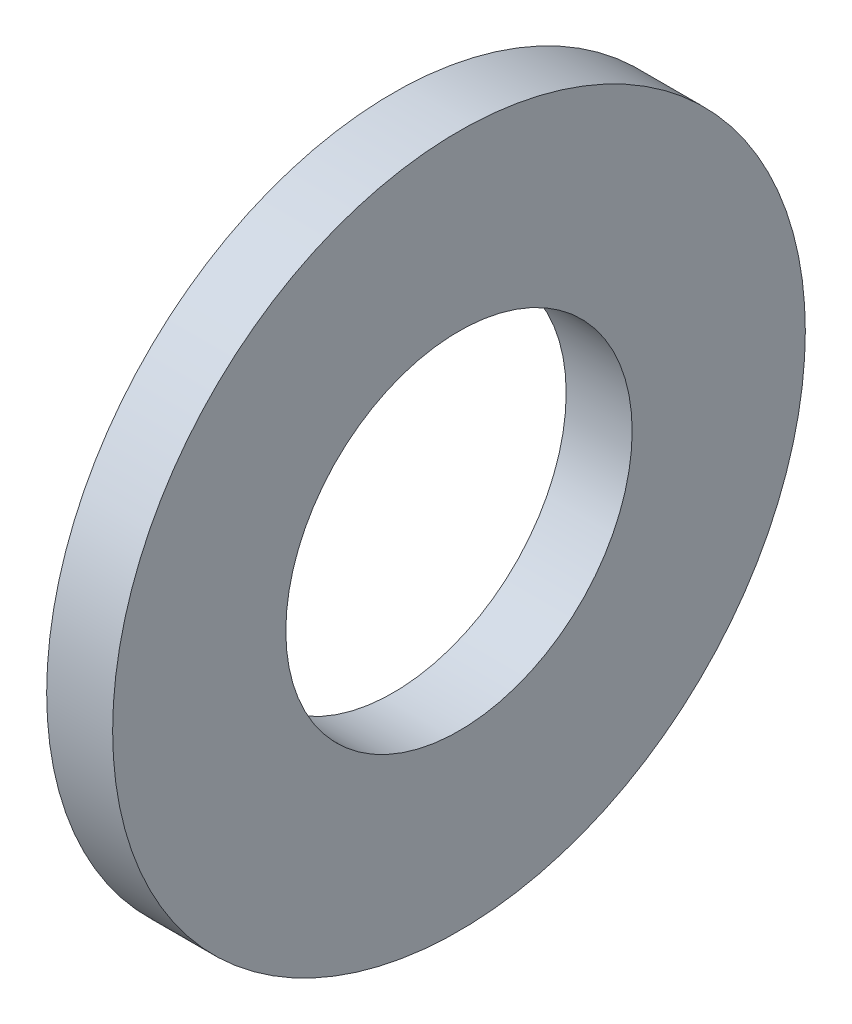
ISO-10303-21;
HEADER;
FILE_DESCRIPTION(('STEP AP214'),'2;1');
FILE_NAME('part.step','',(''),(''),'','','');
FILE_SCHEMA(('AUTOMOTIVE_DESIGN { 1 0 10303 214 1 1 1 1 }'));
ENDSEC;
DATA;
#1=APPLICATION_CONTEXT('core data for automotive mechanical design processes');
#2=APPLICATION_PROTOCOL_DEFINITION('international standard','automotive_design',2000,#1);
#3=PRODUCT_CONTEXT('',#1,'mechanical');
#4=PRODUCT('Part','Part','',(#3));
#5=PRODUCT_RELATED_PRODUCT_CATEGORY('part','',(#4));
#6=PRODUCT_DEFINITION_FORMATION('','',#4);
#7=PRODUCT_DEFINITION_CONTEXT('part definition',#1,'design');
#8=PRODUCT_DEFINITION('design','',#6,#7);
#9=PRODUCT_DEFINITION_SHAPE('','',#8);
#10=(LENGTH_UNIT() NAMED_UNIT(*) SI_UNIT(.MILLI.,.METRE.));
#11=(NAMED_UNIT(*) PLANE_ANGLE_UNIT() SI_UNIT($,.RADIAN.));
#12=(NAMED_UNIT(*) SI_UNIT($,.STERADIAN.) SOLID_ANGLE_UNIT());
#13=UNCERTAINTY_MEASURE_WITH_UNIT(LENGTH_MEASURE(1.E-05),#10,'distance_accuracy_value','');
#14=(GEOMETRIC_REPRESENTATION_CONTEXT(3) GLOBAL_UNCERTAINTY_ASSIGNED_CONTEXT((#13)) GLOBAL_UNIT_ASSIGNED_CONTEXT((#10,
#11,#12)) REPRESENTATION_CONTEXT('',''));
#15=CARTESIAN_POINT('',(0.,0.,0.));
#16=DIRECTION('',(0.,0.,1.));
#17=DIRECTION('',(1.,0.,0.));
#18=AXIS2_PLACEMENT_3D('',#15,#16,#17);
#19=CARTESIAN_POINT('',(0.,10.5,0.));
#20=DIRECTION('',(1.,0.,0.));
#21=DIRECTION('',(0.,0.,-1.));
#22=AXIS2_PLACEMENT_3D('',#19,#20,#21);
#23=PLANE('',#22);
#24=CARTESIAN_POINT('',(0.,0.,0.));
#25=DIRECTION('',(-1.,0.,0.));
#26=DIRECTION('',(0.,0.,1.));
#27=AXIS2_PLACEMENT_3D('',#24,#25,#26);
#28=CIRCLE('',#27,5.25);
#29=CARTESIAN_POINT('',(0.,0.,5.25));
#30=VERTEX_POINT('',#29);
#31=EDGE_CURVE('E10',#30,#30,#28,.T.);
#32=ORIENTED_EDGE('',*,*,#31,.F.);
#33=EDGE_LOOP('',(#32));
#34=FACE_BOUND('',#33,.T.);
#35=CARTESIAN_POINT('',(0.,0.,0.));
#36=DIRECTION('',(-1.,0.,0.));
#37=DIRECTION('',(0.,0.,1.));
#38=AXIS2_PLACEMENT_3D('',#35,#36,#37);
#39=CIRCLE('',#38,10.5);
#40=CARTESIAN_POINT('',(0.,0.,10.5));
#41=VERTEX_POINT('',#40);
#42=EDGE_CURVE('E46',#41,#41,#39,.T.);
#43=ORIENTED_EDGE('',*,*,#42,.T.);
#44=EDGE_LOOP('',(#43));
#45=FACE_BOUND('',#44,.T.);
#46=ADVANCED_FACE('F32',(#34,#45),#23,.F.);
#47=CARTESIAN_POINT('',(4.04616816689106,0.,0.));
#48=DIRECTION('',(-1.,0.,0.));
#49=DIRECTION('',(0.,0.,1.));
#50=AXIS2_PLACEMENT_3D('',#47,#48,#49);
#51=CYLINDRICAL_SURFACE('',#50,5.25);
#52=CARTESIAN_POINT('',(2.,0.,0.));
#53=DIRECTION('',(-1.,0.,0.));
#54=DIRECTION('',(0.,0.,1.));
#55=AXIS2_PLACEMENT_3D('',#52,#53,#54);
#56=CIRCLE('',#55,5.25);
#57=CARTESIAN_POINT('',(2.,0.,5.25));
#58=VERTEX_POINT('',#57);
#59=EDGE_CURVE('E38',#58,#58,#56,.T.);
#60=ORIENTED_EDGE('',*,*,#59,.F.);
#61=EDGE_LOOP('',(#60));
#62=FACE_BOUND('',#61,.T.);
#63=ORIENTED_EDGE('',*,*,#31,.T.);
#64=EDGE_LOOP('',(#63));
#65=FACE_BOUND('',#64,.T.);
#66=ADVANCED_FACE('F61',(#62,#65),#51,.F.);
#67=CARTESIAN_POINT('',(2.,5.25,0.));
#68=DIRECTION('',(-1.,0.,0.));
#69=DIRECTION('',(0.,0.,1.));
#70=AXIS2_PLACEMENT_3D('',#67,#68,#69);
#71=PLANE('',#70);
#72=CARTESIAN_POINT('',(2.,0.,0.));
#73=DIRECTION('',(-1.,0.,0.));
#74=DIRECTION('',(0.,0.,1.));
#75=AXIS2_PLACEMENT_3D('',#72,#73,#74);
#76=CIRCLE('',#75,10.5);
#77=CARTESIAN_POINT('',(2.,0.,10.5));
#78=VERTEX_POINT('',#77);
#79=EDGE_CURVE('E42',#78,#78,#76,.T.);
#80=ORIENTED_EDGE('',*,*,#79,.F.);
#81=EDGE_LOOP('',(#80));
#82=FACE_BOUND('',#81,.T.);
#83=ORIENTED_EDGE('',*,*,#59,.T.);
#84=EDGE_LOOP('',(#83));
#85=FACE_BOUND('',#84,.T.);
#86=ADVANCED_FACE('F56',(#82,#85),#71,.F.);
#87=CARTESIAN_POINT('',(4.04616816689106,0.,0.));
#88=DIRECTION('',(-1.,0.,0.));
#89=DIRECTION('',(0.,0.,1.));
#90=AXIS2_PLACEMENT_3D('',#87,#88,#89);
#91=CYLINDRICAL_SURFACE('',#90,10.5);
#92=ORIENTED_EDGE('',*,*,#42,.F.);
#93=EDGE_LOOP('',(#92));
#94=FACE_BOUND('',#93,.T.);
#95=ORIENTED_EDGE('',*,*,#79,.T.);
#96=EDGE_LOOP('',(#95));
#97=FACE_BOUND('',#96,.T.);
#98=ADVANCED_FACE('F53',(#94,#97),#91,.T.);
#99=CLOSED_SHELL('',(#46,#66,#86,#98));
#100=MANIFOLD_SOLID_BREP('B2',#99);
#101=ADVANCED_BREP_SHAPE_REPRESENTATION('',(#18,#100),#14);
#102=SHAPE_DEFINITION_REPRESENTATION(#9,#101);
ENDSEC;
END-ISO-10303-21;
